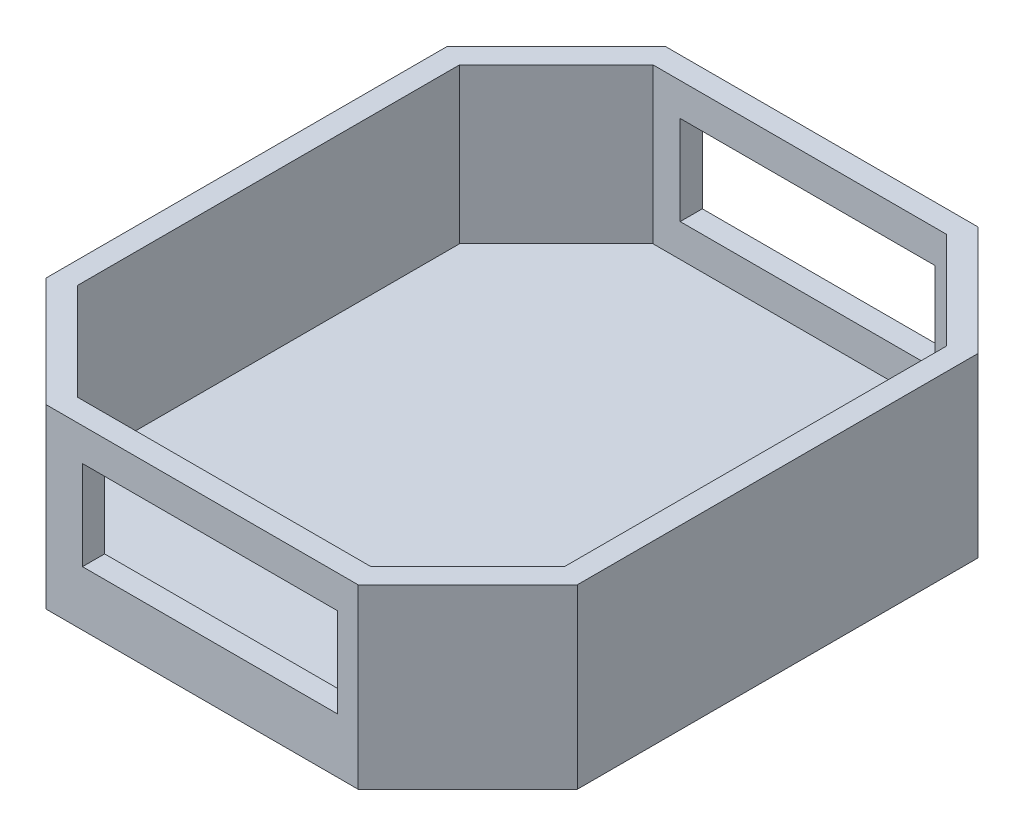
ISO-10303-21;
HEADER;
FILE_DESCRIPTION(('STEP AP214'),'2;1');
FILE_NAME('part.step','',(''),(''),'','','');
FILE_SCHEMA(('AUTOMOTIVE_DESIGN { 1 0 10303 214 1 1 1 1 }'));
ENDSEC;
DATA;
#1=APPLICATION_CONTEXT('core data for automotive mechanical design processes');
#2=APPLICATION_PROTOCOL_DEFINITION('international standard','automotive_design',2000,#1);
#3=PRODUCT_CONTEXT('',#1,'mechanical');
#4=PRODUCT('Part','Part','',(#3));
#5=PRODUCT_RELATED_PRODUCT_CATEGORY('part','',(#4));
#6=PRODUCT_DEFINITION_FORMATION('','',#4);
#7=PRODUCT_DEFINITION_CONTEXT('part definition',#1,'design');
#8=PRODUCT_DEFINITION('design','',#6,#7);
#9=PRODUCT_DEFINITION_SHAPE('','',#8);
#10=(LENGTH_UNIT() NAMED_UNIT(*) SI_UNIT(.MILLI.,.METRE.));
#11=(NAMED_UNIT(*) PLANE_ANGLE_UNIT() SI_UNIT($,.RADIAN.));
#12=(NAMED_UNIT(*) SI_UNIT($,.STERADIAN.) SOLID_ANGLE_UNIT());
#13=UNCERTAINTY_MEASURE_WITH_UNIT(LENGTH_MEASURE(1.E-05),#10,'distance_accuracy_value','');
#14=(GEOMETRIC_REPRESENTATION_CONTEXT(3) GLOBAL_UNCERTAINTY_ASSIGNED_CONTEXT((#13)) GLOBAL_UNIT_ASSIGNED_CONTEXT((#10,
#11,#12)) REPRESENTATION_CONTEXT('',''));
#15=CARTESIAN_POINT('',(0.,0.,0.));
#16=DIRECTION('',(0.,0.,1.));
#17=DIRECTION('',(1.,0.,0.));
#18=AXIS2_PLACEMENT_3D('',#15,#16,#17);
#19=CARTESIAN_POINT('',(0.,101.6,0.));
#20=DIRECTION('',(0.,1.,0.));
#21=DIRECTION('',(0.,0.,1.));
#22=AXIS2_PLACEMENT_3D('',#19,#20,#21);
#23=PLANE('',#22);
#24=DIRECTION('',(0.,0.,-1.));
#25=VECTOR('',#24,1.);
#26=CARTESIAN_POINT('',(-152.4,101.6,0.));
#27=LINE('',#26,#25);
#28=CARTESIAN_POINT('',(-152.4,101.6,114.938207152516));
#29=VERTEX_POINT('',#28);
#30=CARTESIAN_POINT('',(-152.4,101.6,-114.938207152516));
#31=VERTEX_POINT('',#30);
#32=EDGE_CURVE('E358',#29,#31,#27,.T.);
#33=ORIENTED_EDGE('',*,*,#32,.F.);
#34=DIRECTION('',(0.707106781186547,0.,0.707106781186548));
#35=VECTOR('',#34,1.);
#36=CARTESIAN_POINT('',(-133.669103576258,101.6,133.669103576258));
#37=LINE('',#36,#35);
#38=CARTESIAN_POINT('',(-89.538207152516,101.6,177.8));
#39=VERTEX_POINT('',#38);
#40=EDGE_CURVE('E362',#29,#39,#37,.T.);
#41=ORIENTED_EDGE('',*,*,#40,.T.);
#42=DIRECTION('',(1.,0.,0.));
#43=VECTOR('',#42,1.);
#44=CARTESIAN_POINT('',(0.,101.6,177.8));
#45=LINE('',#44,#43);
#46=CARTESIAN_POINT('',(89.538207152516,101.6,177.8));
#47=VERTEX_POINT('',#46);
#48=EDGE_CURVE('E366',#39,#47,#45,.T.);
#49=ORIENTED_EDGE('',*,*,#48,.T.);
#50=DIRECTION('',(-0.707106781186546,0.,0.707106781186549));
#51=VECTOR('',#50,1.);
#52=CARTESIAN_POINT('',(133.669103576258,101.6,133.669103576258));
#53=LINE('',#52,#51);
#54=CARTESIAN_POINT('',(152.4,101.6,114.938207152516));
#55=VERTEX_POINT('',#54);
#56=EDGE_CURVE('E369',#55,#47,#53,.T.);
#57=ORIENTED_EDGE('',*,*,#56,.F.);
#58=DIRECTION('',(0.,0.,-1.));
#59=VECTOR('',#58,1.);
#60=CARTESIAN_POINT('',(152.4,101.6,0.));
#61=LINE('',#60,#59);
#62=CARTESIAN_POINT('',(152.4,101.6,-114.938207152516));
#63=VERTEX_POINT('',#62);
#64=EDGE_CURVE('E373',#55,#63,#61,.T.);
#65=ORIENTED_EDGE('',*,*,#64,.T.);
#66=DIRECTION('',(-0.707106781186546,0.,-0.707106781186549));
#67=VECTOR('',#66,1.);
#68=CARTESIAN_POINT('',(133.669103576258,101.6,-133.669103576258));
#69=LINE('',#68,#67);
#70=CARTESIAN_POINT('',(89.538207152516,101.6,-177.8));
#71=VERTEX_POINT('',#70);
#72=EDGE_CURVE('E376',#63,#71,#69,.T.);
#73=ORIENTED_EDGE('',*,*,#72,.T.);
#74=DIRECTION('',(1.,0.,0.));
#75=VECTOR('',#74,1.);
#76=CARTESIAN_POINT('',(0.,101.6,-177.8));
#77=LINE('',#76,#75);
#78=CARTESIAN_POINT('',(-89.538207152516,101.6,-177.8));
#79=VERTEX_POINT('',#78);
#80=EDGE_CURVE('E379',#79,#71,#77,.T.);
#81=ORIENTED_EDGE('',*,*,#80,.F.);
#82=DIRECTION('',(0.707106781186546,0.,-0.707106781186549));
#83=VECTOR('',#82,1.);
#84=CARTESIAN_POINT('',(-133.669103576258,101.6,-133.669103576258));
#85=LINE('',#84,#83);
#86=EDGE_CURVE('E383',#31,#79,#85,.T.);
#87=ORIENTED_EDGE('',*,*,#86,.F.);
#88=EDGE_LOOP('',(#33,#41,#49,#57,#65,#73,#81,#87));
#89=FACE_BOUND('',#88,.T.);
#90=DIRECTION('',(0.707106781186547,0.,0.707106781186548));
#91=VECTOR('',#90,1.);
#92=CARTESIAN_POINT('',(-124.688847455189,101.6,124.688847455189));
#93=LINE('',#92,#91);
#94=CARTESIAN_POINT('',(-139.7,101.6,109.677694910378));
#95=VERTEX_POINT('',#94);
#96=CARTESIAN_POINT('',(-84.2776949103777,101.6,165.1));
#97=VERTEX_POINT('',#96);
#98=EDGE_CURVE('E335',#95,#97,#93,.T.);
#99=ORIENTED_EDGE('',*,*,#98,.F.);
#100=DIRECTION('',(0.,0.,-1.));
#101=VECTOR('',#100,1.);
#102=CARTESIAN_POINT('',(-139.7,101.6,0.));
#103=LINE('',#102,#101);
#104=CARTESIAN_POINT('',(-139.7,101.6,-109.677694910377));
#105=VERTEX_POINT('',#104);
#106=EDGE_CURVE('E331',#95,#105,#103,.T.);
#107=ORIENTED_EDGE('',*,*,#106,.T.);
#108=DIRECTION('',(0.707106781186546,0.,-0.707106781186549));
#109=VECTOR('',#108,1.);
#110=CARTESIAN_POINT('',(-124.688847455189,101.6,-124.688847455189));
#111=LINE('',#110,#109);
#112=CARTESIAN_POINT('',(-84.2776949103777,101.6,-165.1));
#113=VERTEX_POINT('',#112);
#114=EDGE_CURVE('E287',#105,#113,#111,.T.);
#115=ORIENTED_EDGE('',*,*,#114,.T.);
#116=DIRECTION('',(1.,0.,0.));
#117=VECTOR('',#116,1.);
#118=CARTESIAN_POINT('',(0.,101.6,-165.1));
#119=LINE('',#118,#117);
#120=CARTESIAN_POINT('',(84.2776949103777,101.6,-165.1));
#121=VERTEX_POINT('',#120);
#122=EDGE_CURVE('E351',#113,#121,#119,.T.);
#123=ORIENTED_EDGE('',*,*,#122,.T.);
#124=DIRECTION('',(-0.707106781186546,0.,-0.707106781186549));
#125=VECTOR('',#124,1.);
#126=CARTESIAN_POINT('',(124.688847455189,101.6,-124.688847455189));
#127=LINE('',#126,#125);
#128=CARTESIAN_POINT('',(139.7,101.6,-109.677694910377));
#129=VERTEX_POINT('',#128);
#130=EDGE_CURVE('E348',#129,#121,#127,.T.);
#131=ORIENTED_EDGE('',*,*,#130,.F.);
#132=DIRECTION('',(0.,0.,-1.));
#133=VECTOR('',#132,1.);
#134=CARTESIAN_POINT('',(139.7,101.6,0.));
#135=LINE('',#134,#133);
#136=CARTESIAN_POINT('',(139.7,101.6,109.677694910377));
#137=VERTEX_POINT('',#136);
#138=EDGE_CURVE('E345',#137,#129,#135,.T.);
#139=ORIENTED_EDGE('',*,*,#138,.F.);
#140=DIRECTION('',(-0.707106781186546,0.,0.707106781186549));
#141=VECTOR('',#140,1.);
#142=CARTESIAN_POINT('',(124.688847455189,101.6,124.688847455189));
#143=LINE('',#142,#141);
#144=CARTESIAN_POINT('',(84.2776949103777,101.6,165.1));
#145=VERTEX_POINT('',#144);
#146=EDGE_CURVE('E341',#137,#145,#143,.T.);
#147=ORIENTED_EDGE('',*,*,#146,.T.);
#148=DIRECTION('',(1.,0.,0.));
#149=VECTOR('',#148,1.);
#150=CARTESIAN_POINT('',(0.,101.6,165.1));
#151=LINE('',#150,#149);
#152=EDGE_CURVE('E338',#97,#145,#151,.T.);
#153=ORIENTED_EDGE('',*,*,#152,.F.);
#154=EDGE_LOOP('',(#99,#107,#115,#123,#131,#139,#147,#153));
#155=FACE_BOUND('',#154,.T.);
#156=ADVANCED_FACE('F40',(#89,#155),#23,.T.);
#157=CARTESIAN_POINT('',(-152.4,101.6,0.));
#158=DIRECTION('',(-1.,0.,0.));
#159=DIRECTION('',(0.,0.,1.));
#160=AXIS2_PLACEMENT_3D('',#157,#158,#159);
#161=PLANE('',#160);
#162=DIRECTION('',(0.,0.,-1.));
#163=VECTOR('',#162,1.);
#164=CARTESIAN_POINT('',(-152.4,0.,0.));
#165=LINE('',#164,#163);
#166=CARTESIAN_POINT('',(-152.4,0.,114.938207152516));
#167=VERTEX_POINT('',#166);
#168=CARTESIAN_POINT('',(-152.4,0.,-114.938207152516));
#169=VERTEX_POINT('',#168);
#170=EDGE_CURVE('E281',#167,#169,#165,.T.);
#171=ORIENTED_EDGE('',*,*,#170,.F.);
#172=DIRECTION('',(0.,-1.,0.));
#173=VECTOR('',#172,1.);
#174=CARTESIAN_POINT('',(-152.4,101.6,114.938207152516));
#175=LINE('',#174,#173);
#176=EDGE_CURVE('E438',#29,#167,#175,.T.);
#177=ORIENTED_EDGE('',*,*,#176,.F.);
#178=ORIENTED_EDGE('',*,*,#32,.T.);
#179=DIRECTION('',(0.,-1.,0.));
#180=VECTOR('',#179,1.);
#181=CARTESIAN_POINT('',(-152.4,101.6,-114.938207152516));
#182=LINE('',#181,#180);
#183=EDGE_CURVE('E387',#31,#169,#182,.T.);
#184=ORIENTED_EDGE('',*,*,#183,.T.);
#185=EDGE_LOOP('',(#171,#177,#178,#184));
#186=FACE_BOUND('',#185,.T.);
#187=ADVANCED_FACE('F42',(#186),#161,.T.);
#188=CARTESIAN_POINT('',(-133.669103576258,101.6,133.669103576258));
#189=DIRECTION('',(0.707106781186548,0.,-0.707106781186547));
#190=DIRECTION('',(-0.707106781186547,0.,-0.707106781186548));
#191=AXIS2_PLACEMENT_3D('',#188,#189,#190);
#192=PLANE('',#191);
#193=DIRECTION('',(0.707106781186547,0.,0.707106781186548));
#194=VECTOR('',#193,1.);
#195=CARTESIAN_POINT('',(-133.669103576258,0.,133.669103576258));
#196=LINE('',#195,#194);
#197=CARTESIAN_POINT('',(-89.538207152516,0.,177.8));
#198=VERTEX_POINT('',#197);
#199=EDGE_CURVE('E391',#167,#198,#196,.T.);
#200=ORIENTED_EDGE('',*,*,#199,.T.);
#201=DIRECTION('',(0.,-1.,0.));
#202=VECTOR('',#201,1.);
#203=CARTESIAN_POINT('',(-89.538207152516,101.6,177.8));
#204=LINE('',#203,#202);
#205=EDGE_CURVE('E434',#39,#198,#204,.T.);
#206=ORIENTED_EDGE('',*,*,#205,.F.);
#207=ORIENTED_EDGE('',*,*,#40,.F.);
#208=ORIENTED_EDGE('',*,*,#176,.T.);
#209=EDGE_LOOP('',(#200,#206,#207,#208));
#210=FACE_BOUND('',#209,.T.);
#211=ADVANCED_FACE('F475',(#210),#192,.F.);
#212=CARTESIAN_POINT('',(0.,101.6,177.8));
#213=DIRECTION('',(0.,0.,-1.));
#214=DIRECTION('',(-1.,0.,0.));
#215=AXIS2_PLACEMENT_3D('',#212,#213,#214);
#216=PLANE('',#215);
#217=DIRECTION('',(-1.,0.,0.));
#218=VECTOR('',#217,1.);
#219=CARTESIAN_POINT('',(0.,31.5269986114117,177.8));
#220=LINE('',#219,#218);
#221=CARTESIAN_POINT('',(77.5539961818055,31.5269986114117,177.8));
#222=VERTEX_POINT('',#221);
#223=CARTESIAN_POINT('',(-68.611413043314,31.5269986114117,177.8));
#224=VERTEX_POINT('',#223);
#225=EDGE_CURVE('E247',#222,#224,#220,.T.);
#226=ORIENTED_EDGE('',*,*,#225,.T.);
#227=DIRECTION('',(0.,1.,0.));
#228=VECTOR('',#227,1.);
#229=CARTESIAN_POINT('',(-68.611413043314,101.6,177.8));
#230=LINE('',#229,#228);
#231=CARTESIAN_POINT('',(-68.611413043314,82.7779494950676,177.8));
#232=VERTEX_POINT('',#231);
#233=EDGE_CURVE('E269',#224,#232,#230,.T.);
#234=ORIENTED_EDGE('',*,*,#233,.T.);
#235=DIRECTION('',(1.,0.,0.));
#236=VECTOR('',#235,1.);
#237=CARTESIAN_POINT('',(0.,82.7779494950676,177.8));
#238=LINE('',#237,#236);
#239=CARTESIAN_POINT('',(77.5539961818055,82.7779494950676,177.8));
#240=VERTEX_POINT('',#239);
#241=EDGE_CURVE('E262',#232,#240,#238,.T.);
#242=ORIENTED_EDGE('',*,*,#241,.T.);
#243=DIRECTION('',(0.,-1.,0.));
#244=VECTOR('',#243,1.);
#245=CARTESIAN_POINT('',(77.5539961818055,101.6,177.8));
#246=LINE('',#245,#244);
#247=EDGE_CURVE('E255',#240,#222,#246,.T.);
#248=ORIENTED_EDGE('',*,*,#247,.T.);
#249=EDGE_LOOP('',(#226,#234,#242,#248));
#250=FACE_BOUND('',#249,.T.);
#251=DIRECTION('',(1.,0.,0.));
#252=VECTOR('',#251,1.);
#253=CARTESIAN_POINT('',(0.,0.,177.8));
#254=LINE('',#253,#252);
#255=CARTESIAN_POINT('',(89.538207152516,0.,177.8));
#256=VERTEX_POINT('',#255);
#257=EDGE_CURVE('E394',#198,#256,#254,.T.);
#258=ORIENTED_EDGE('',*,*,#257,.T.);
#259=DIRECTION('',(0.,-1.,0.));
#260=VECTOR('',#259,1.);
#261=CARTESIAN_POINT('',(89.538207152516,101.6,177.8));
#262=LINE('',#261,#260);
#263=EDGE_CURVE('E431',#47,#256,#262,.T.);
#264=ORIENTED_EDGE('',*,*,#263,.F.);
#265=ORIENTED_EDGE('',*,*,#48,.F.);
#266=ORIENTED_EDGE('',*,*,#205,.T.);
#267=EDGE_LOOP('',(#258,#264,#265,#266));
#268=FACE_BOUND('',#267,.T.);
#269=ADVANCED_FACE('F504',(#250,#268),#216,.F.);
#270=CARTESIAN_POINT('',(133.669103576258,101.6,133.669103576258));
#271=DIRECTION('',(0.707106781186549,0.,0.707106781186546));
#272=DIRECTION('',(0.707106781186546,0.,-0.707106781186549));
#273=AXIS2_PLACEMENT_3D('',#270,#271,#272);
#274=PLANE('',#273);
#275=DIRECTION('',(-0.707106781186546,0.,0.707106781186549));
#276=VECTOR('',#275,1.);
#277=CARTESIAN_POINT('',(133.669103576258,0.,133.669103576258));
#278=LINE('',#277,#276);
#279=CARTESIAN_POINT('',(152.4,0.,114.938207152516));
#280=VERTEX_POINT('',#279);
#281=EDGE_CURVE('E398',#280,#256,#278,.T.);
#282=ORIENTED_EDGE('',*,*,#281,.F.);
#283=DIRECTION('',(0.,-1.,0.));
#284=VECTOR('',#283,1.);
#285=CARTESIAN_POINT('',(152.4,101.6,114.938207152516));
#286=LINE('',#285,#284);
#287=EDGE_CURVE('E428',#55,#280,#286,.T.);
#288=ORIENTED_EDGE('',*,*,#287,.F.);
#289=ORIENTED_EDGE('',*,*,#56,.T.);
#290=ORIENTED_EDGE('',*,*,#263,.T.);
#291=EDGE_LOOP('',(#282,#288,#289,#290));
#292=FACE_BOUND('',#291,.T.);
#293=ADVANCED_FACE('F500',(#292),#274,.T.);
#294=CARTESIAN_POINT('',(152.4,101.6,0.));
#295=DIRECTION('',(-1.,0.,0.));
#296=DIRECTION('',(0.,0.,1.));
#297=AXIS2_PLACEMENT_3D('',#294,#295,#296);
#298=PLANE('',#297);
#299=DIRECTION('',(0.,0.,-1.));
#300=VECTOR('',#299,1.);
#301=CARTESIAN_POINT('',(152.4,0.,0.));
#302=LINE('',#301,#300);
#303=CARTESIAN_POINT('',(152.4,0.,-114.938207152516));
#304=VERTEX_POINT('',#303);
#305=EDGE_CURVE('E402',#280,#304,#302,.T.);
#306=ORIENTED_EDGE('',*,*,#305,.T.);
#307=DIRECTION('',(0.,-1.,0.));
#308=VECTOR('',#307,1.);
#309=CARTESIAN_POINT('',(152.4,101.6,-114.938207152516));
#310=LINE('',#309,#308);
#311=EDGE_CURVE('E424',#63,#304,#310,.T.);
#312=ORIENTED_EDGE('',*,*,#311,.F.);
#313=ORIENTED_EDGE('',*,*,#64,.F.);
#314=ORIENTED_EDGE('',*,*,#287,.T.);
#315=EDGE_LOOP('',(#306,#312,#313,#314));
#316=FACE_BOUND('',#315,.T.);
#317=ADVANCED_FACE('F496',(#316),#298,.F.);
#318=CARTESIAN_POINT('',(133.669103576258,101.6,-133.669103576258));
#319=DIRECTION('',(-0.707106781186549,0.,0.707106781186546));
#320=DIRECTION('',(0.707106781186546,0.,0.707106781186549));
#321=AXIS2_PLACEMENT_3D('',#318,#319,#320);
#322=PLANE('',#321);
#323=DIRECTION('',(-0.707106781186546,0.,-0.707106781186549));
#324=VECTOR('',#323,1.);
#325=CARTESIAN_POINT('',(133.669103576258,0.,-133.669103576258));
#326=LINE('',#325,#324);
#327=CARTESIAN_POINT('',(89.538207152516,0.,-177.8));
#328=VERTEX_POINT('',#327);
#329=EDGE_CURVE('E405',#304,#328,#326,.T.);
#330=ORIENTED_EDGE('',*,*,#329,.T.);
#331=DIRECTION('',(0.,-1.,0.));
#332=VECTOR('',#331,1.);
#333=CARTESIAN_POINT('',(89.538207152516,101.6,-177.8));
#334=LINE('',#333,#332);
#335=EDGE_CURVE('E421',#71,#328,#334,.T.);
#336=ORIENTED_EDGE('',*,*,#335,.F.);
#337=ORIENTED_EDGE('',*,*,#72,.F.);
#338=ORIENTED_EDGE('',*,*,#311,.T.);
#339=EDGE_LOOP('',(#330,#336,#337,#338));
#340=FACE_BOUND('',#339,.T.);
#341=ADVANCED_FACE('F493',(#340),#322,.F.);
#342=CARTESIAN_POINT('',(0.,101.6,-177.8));
#343=DIRECTION('',(0.,0.,-1.));
#344=DIRECTION('',(-1.,0.,0.));
#345=AXIS2_PLACEMENT_3D('',#342,#343,#344);
#346=PLANE('',#345);
#347=DIRECTION('',(0.,-1.,0.));
#348=VECTOR('',#347,1.);
#349=CARTESIAN_POINT('',(-68.611413043314,31.5269986114117,-177.8));
#350=LINE('',#349,#348);
#351=CARTESIAN_POINT('',(-68.611413043314,82.7779494950676,-177.8));
#352=VERTEX_POINT('',#351);
#353=CARTESIAN_POINT('',(-68.611413043314,31.5269986114117,-177.8));
#354=VERTEX_POINT('',#353);
#355=EDGE_CURVE('E208',#352,#354,#350,.T.);
#356=ORIENTED_EDGE('',*,*,#355,.T.);
#357=DIRECTION('',(1.,0.,0.));
#358=VECTOR('',#357,1.);
#359=CARTESIAN_POINT('',(-68.611413043314,31.5269986114117,-177.8));
#360=LINE('',#359,#358);
#361=CARTESIAN_POINT('',(77.5539961818055,31.5269986114117,-177.8));
#362=VERTEX_POINT('',#361);
#363=EDGE_CURVE('E216',#354,#362,#360,.T.);
#364=ORIENTED_EDGE('',*,*,#363,.T.);
#365=DIRECTION('',(0.,1.,0.));
#366=VECTOR('',#365,1.);
#367=CARTESIAN_POINT('',(77.5539961818055,31.5269986114117,-177.8));
#368=LINE('',#367,#366);
#369=CARTESIAN_POINT('',(77.5539961818055,82.7779494950676,-177.8));
#370=VERTEX_POINT('',#369);
#371=EDGE_CURVE('E64',#362,#370,#368,.T.);
#372=ORIENTED_EDGE('',*,*,#371,.T.);
#373=DIRECTION('',(-1.,0.,0.));
#374=VECTOR('',#373,1.);
#375=CARTESIAN_POINT('',(-68.611413043314,82.7779494950676,-177.8));
#376=LINE('',#375,#374);
#377=EDGE_CURVE('E225',#370,#352,#376,.T.);
#378=ORIENTED_EDGE('',*,*,#377,.T.);
#379=EDGE_LOOP('',(#356,#364,#372,#378));
#380=FACE_BOUND('',#379,.T.);
#381=DIRECTION('',(1.,0.,0.));
#382=VECTOR('',#381,1.);
#383=CARTESIAN_POINT('',(0.,0.,-177.8));
#384=LINE('',#383,#382);
#385=CARTESIAN_POINT('',(-89.538207152516,0.,-177.8));
#386=VERTEX_POINT('',#385);
#387=EDGE_CURVE('E409',#386,#328,#384,.T.);
#388=ORIENTED_EDGE('',*,*,#387,.F.);
#389=DIRECTION('',(0.,-1.,0.));
#390=VECTOR('',#389,1.);
#391=CARTESIAN_POINT('',(-89.538207152516,101.6,-177.8));
#392=LINE('',#391,#390);
#393=EDGE_CURVE('E418',#79,#386,#392,.T.);
#394=ORIENTED_EDGE('',*,*,#393,.F.);
#395=ORIENTED_EDGE('',*,*,#80,.T.);
#396=ORIENTED_EDGE('',*,*,#335,.T.);
#397=EDGE_LOOP('',(#388,#394,#395,#396));
#398=FACE_BOUND('',#397,.T.);
#399=ADVANCED_FACE('F222',(#380,#398),#346,.T.);
#400=CARTESIAN_POINT('',(-133.669103576258,101.6,-133.669103576258));
#401=DIRECTION('',(-0.707106781186549,0.,-0.707106781186546));
#402=DIRECTION('',(-0.707106781186546,0.,0.707106781186549));
#403=AXIS2_PLACEMENT_3D('',#400,#401,#402);
#404=PLANE('',#403);
#405=DIRECTION('',(0.707106781186546,0.,-0.707106781186549));
#406=VECTOR('',#405,1.);
#407=CARTESIAN_POINT('',(-133.669103576258,0.,-133.669103576258));
#408=LINE('',#407,#406);
#409=EDGE_CURVE('E363',#169,#386,#408,.T.);
#410=ORIENTED_EDGE('',*,*,#409,.F.);
#411=ORIENTED_EDGE('',*,*,#183,.F.);
#412=ORIENTED_EDGE('',*,*,#86,.T.);
#413=ORIENTED_EDGE('',*,*,#393,.T.);
#414=EDGE_LOOP('',(#410,#411,#412,#413));
#415=FACE_BOUND('',#414,.T.);
#416=ADVANCED_FACE('F486',(#415),#404,.T.);
#417=CARTESIAN_POINT('',(0.,0.,0.));
#418=DIRECTION('',(0.,1.,0.));
#419=DIRECTION('',(0.,0.,1.));
#420=AXIS2_PLACEMENT_3D('',#417,#418,#419);
#421=PLANE('',#420);
#422=ORIENTED_EDGE('',*,*,#170,.T.);
#423=ORIENTED_EDGE('',*,*,#409,.T.);
#424=ORIENTED_EDGE('',*,*,#387,.T.);
#425=ORIENTED_EDGE('',*,*,#329,.F.);
#426=ORIENTED_EDGE('',*,*,#305,.F.);
#427=ORIENTED_EDGE('',*,*,#281,.T.);
#428=ORIENTED_EDGE('',*,*,#257,.F.);
#429=ORIENTED_EDGE('',*,*,#199,.F.);
#430=EDGE_LOOP('',(#422,#423,#424,#425,#426,#427,#428,#429));
#431=FACE_BOUND('',#430,.T.);
#432=ADVANCED_FACE('F482',(#431),#421,.F.);
#433=CARTESIAN_POINT('',(-139.7,101.6,0.));
#434=DIRECTION('',(-1.,0.,0.));
#435=DIRECTION('',(0.,0.,1.));
#436=AXIS2_PLACEMENT_3D('',#433,#434,#435);
#437=PLANE('',#436);
#438=DIRECTION('',(0.,0.,-1.));
#439=VECTOR('',#438,1.);
#440=CARTESIAN_POINT('',(-139.7,12.7,0.));
#441=LINE('',#440,#439);
#442=CARTESIAN_POINT('',(-139.7,12.7,109.677694910378));
#443=VERTEX_POINT('',#442);
#444=CARTESIAN_POINT('',(-139.7,12.7,-109.677694910377));
#445=VERTEX_POINT('',#444);
#446=EDGE_CURVE('E273',#443,#445,#441,.T.);
#447=ORIENTED_EDGE('',*,*,#446,.T.);
#448=DIRECTION('',(0.,-1.,0.));
#449=VECTOR('',#448,1.);
#450=CARTESIAN_POINT('',(-139.7,101.6,-109.677694910377));
#451=LINE('',#450,#449);
#452=EDGE_CURVE('E283',#105,#445,#451,.T.);
#453=ORIENTED_EDGE('',*,*,#452,.F.);
#454=ORIENTED_EDGE('',*,*,#106,.F.);
#455=DIRECTION('',(0.,-1.,0.));
#456=VECTOR('',#455,1.);
#457=CARTESIAN_POINT('',(-139.7,101.6,109.677694910378));
#458=LINE('',#457,#456);
#459=EDGE_CURVE('E278',#95,#443,#458,.T.);
#460=ORIENTED_EDGE('',*,*,#459,.T.);
#461=EDGE_LOOP('',(#447,#453,#454,#460));
#462=FACE_BOUND('',#461,.T.);
#463=ADVANCED_FACE('F485',(#462),#437,.F.);
#464=CARTESIAN_POINT('',(-124.688847455189,101.6,124.688847455189));
#465=DIRECTION('',(0.707106781186548,0.,-0.707106781186547));
#466=DIRECTION('',(-0.707106781186547,0.,-0.707106781186548));
#467=AXIS2_PLACEMENT_3D('',#464,#465,#466);
#468=PLANE('',#467);
#469=DIRECTION('',(0.707106781186547,0.,0.707106781186548));
#470=VECTOR('',#469,1.);
#471=CARTESIAN_POINT('',(-124.688847455189,12.7,124.688847455189));
#472=LINE('',#471,#470);
#473=CARTESIAN_POINT('',(-84.2776949103777,12.7,165.1));
#474=VERTEX_POINT('',#473);
#475=EDGE_CURVE('E277',#443,#474,#472,.T.);
#476=ORIENTED_EDGE('',*,*,#475,.F.);
#477=ORIENTED_EDGE('',*,*,#459,.F.);
#478=ORIENTED_EDGE('',*,*,#98,.T.);
#479=DIRECTION('',(0.,-1.,0.));
#480=VECTOR('',#479,1.);
#481=CARTESIAN_POINT('',(-84.2776949103777,101.6,165.1));
#482=LINE('',#481,#480);
#483=EDGE_CURVE('E282',#97,#474,#482,.T.);
#484=ORIENTED_EDGE('',*,*,#483,.T.);
#485=EDGE_LOOP('',(#476,#477,#478,#484));
#486=FACE_BOUND('',#485,.T.);
#487=ADVANCED_FACE('F574',(#486),#468,.T.);
#488=CARTESIAN_POINT('',(0.,101.6,165.1));
#489=DIRECTION('',(0.,0.,-1.));
#490=DIRECTION('',(-1.,0.,0.));
#491=AXIS2_PLACEMENT_3D('',#488,#489,#490);
#492=PLANE('',#491);
#493=DIRECTION('',(0.,1.,0.));
#494=VECTOR('',#493,1.);
#495=CARTESIAN_POINT('',(-68.611413043314,101.6,165.1));
#496=LINE('',#495,#494);
#497=CARTESIAN_POINT('',(-68.611413043314,31.5269986114117,165.1));
#498=VERTEX_POINT('',#497);
#499=CARTESIAN_POINT('',(-68.611413043314,82.7779494950676,165.1));
#500=VERTEX_POINT('',#499);
#501=EDGE_CURVE('E266',#498,#500,#496,.T.);
#502=ORIENTED_EDGE('',*,*,#501,.F.);
#503=DIRECTION('',(-1.,0.,0.));
#504=VECTOR('',#503,1.);
#505=CARTESIAN_POINT('',(0.,31.5269986114117,165.1));
#506=LINE('',#505,#504);
#507=CARTESIAN_POINT('',(77.5539961818055,31.5269986114117,165.1));
#508=VERTEX_POINT('',#507);
#509=EDGE_CURVE('E236',#508,#498,#506,.T.);
#510=ORIENTED_EDGE('',*,*,#509,.F.);
#511=DIRECTION('',(0.,-1.,0.));
#512=VECTOR('',#511,1.);
#513=CARTESIAN_POINT('',(77.5539961818055,101.6,165.1));
#514=LINE('',#513,#512);
#515=CARTESIAN_POINT('',(77.5539961818055,82.7779494950676,165.1));
#516=VERTEX_POINT('',#515);
#517=EDGE_CURVE('E251',#516,#508,#514,.T.);
#518=ORIENTED_EDGE('',*,*,#517,.F.);
#519=DIRECTION('',(1.,0.,0.));
#520=VECTOR('',#519,1.);
#521=CARTESIAN_POINT('',(0.,82.7779494950676,165.1));
#522=LINE('',#521,#520);
#523=EDGE_CURVE('E259',#500,#516,#522,.T.);
#524=ORIENTED_EDGE('',*,*,#523,.F.);
#525=EDGE_LOOP('',(#502,#510,#518,#524));
#526=FACE_BOUND('',#525,.T.);
#527=DIRECTION('',(1.,0.,0.));
#528=VECTOR('',#527,1.);
#529=CARTESIAN_POINT('',(0.,12.7,165.1));
#530=LINE('',#529,#528);
#531=CARTESIAN_POINT('',(84.2776949103777,12.7,165.1));
#532=VERTEX_POINT('',#531);
#533=EDGE_CURVE('E290',#474,#532,#530,.T.);
#534=ORIENTED_EDGE('',*,*,#533,.F.);
#535=ORIENTED_EDGE('',*,*,#483,.F.);
#536=ORIENTED_EDGE('',*,*,#152,.T.);
#537=DIRECTION('',(0.,-1.,0.));
#538=VECTOR('',#537,1.);
#539=CARTESIAN_POINT('',(84.2776949103777,101.6,165.1));
#540=LINE('',#539,#538);
#541=EDGE_CURVE('E294',#145,#532,#540,.T.);
#542=ORIENTED_EDGE('',*,*,#541,.T.);
#543=EDGE_LOOP('',(#534,#535,#536,#542));
#544=FACE_BOUND('',#543,.T.);
#545=ADVANCED_FACE('F582',(#526,#544),#492,.T.);
#546=CARTESIAN_POINT('',(124.688847455189,101.6,124.688847455189));
#547=DIRECTION('',(0.707106781186549,0.,0.707106781186546));
#548=DIRECTION('',(0.707106781186546,0.,-0.707106781186549));
#549=AXIS2_PLACEMENT_3D('',#546,#547,#548);
#550=PLANE('',#549);
#551=DIRECTION('',(-0.707106781186546,0.,0.707106781186549));
#552=VECTOR('',#551,1.);
#553=CARTESIAN_POINT('',(124.688847455189,12.7,124.688847455189));
#554=LINE('',#553,#552);
#555=CARTESIAN_POINT('',(139.7,12.7,109.677694910377));
#556=VERTEX_POINT('',#555);
#557=EDGE_CURVE('E298',#556,#532,#554,.T.);
#558=ORIENTED_EDGE('',*,*,#557,.T.);
#559=ORIENTED_EDGE('',*,*,#541,.F.);
#560=ORIENTED_EDGE('',*,*,#146,.F.);
#561=DIRECTION('',(0.,-1.,0.));
#562=VECTOR('',#561,1.);
#563=CARTESIAN_POINT('',(139.7,101.6,109.677694910377));
#564=LINE('',#563,#562);
#565=EDGE_CURVE('E301',#137,#556,#564,.T.);
#566=ORIENTED_EDGE('',*,*,#565,.T.);
#567=EDGE_LOOP('',(#558,#559,#560,#566));
#568=FACE_BOUND('',#567,.T.);
#569=ADVANCED_FACE('F591',(#568),#550,.F.);
#570=CARTESIAN_POINT('',(139.7,101.6,0.));
#571=DIRECTION('',(-1.,0.,0.));
#572=DIRECTION('',(0.,0.,1.));
#573=AXIS2_PLACEMENT_3D('',#570,#571,#572);
#574=PLANE('',#573);
#575=DIRECTION('',(0.,0.,-1.));
#576=VECTOR('',#575,1.);
#577=CARTESIAN_POINT('',(139.7,12.7,0.));
#578=LINE('',#577,#576);
#579=CARTESIAN_POINT('',(139.7,12.7,-109.677694910377));
#580=VERTEX_POINT('',#579);
#581=EDGE_CURVE('E305',#556,#580,#578,.T.);
#582=ORIENTED_EDGE('',*,*,#581,.F.);
#583=ORIENTED_EDGE('',*,*,#565,.F.);
#584=ORIENTED_EDGE('',*,*,#138,.T.);
#585=DIRECTION('',(0.,-1.,0.));
#586=VECTOR('',#585,1.);
#587=CARTESIAN_POINT('',(139.7,101.6,-109.677694910377));
#588=LINE('',#587,#586);
#589=EDGE_CURVE('E308',#129,#580,#588,.T.);
#590=ORIENTED_EDGE('',*,*,#589,.T.);
#591=EDGE_LOOP('',(#582,#583,#584,#590));
#592=FACE_BOUND('',#591,.T.);
#593=ADVANCED_FACE('F601',(#592),#574,.T.);
#594=CARTESIAN_POINT('',(124.688847455189,101.6,-124.688847455189));
#595=DIRECTION('',(-0.707106781186549,0.,0.707106781186546));
#596=DIRECTION('',(0.707106781186546,0.,0.707106781186549));
#597=AXIS2_PLACEMENT_3D('',#594,#595,#596);
#598=PLANE('',#597);
#599=DIRECTION('',(-0.707106781186546,0.,-0.707106781186549));
#600=VECTOR('',#599,1.);
#601=CARTESIAN_POINT('',(124.688847455189,12.7,-124.688847455189));
#602=LINE('',#601,#600);
#603=CARTESIAN_POINT('',(84.2776949103777,12.7,-165.1));
#604=VERTEX_POINT('',#603);
#605=EDGE_CURVE('E311',#580,#604,#602,.T.);
#606=ORIENTED_EDGE('',*,*,#605,.F.);
#607=ORIENTED_EDGE('',*,*,#589,.F.);
#608=ORIENTED_EDGE('',*,*,#130,.T.);
#609=DIRECTION('',(0.,-1.,0.));
#610=VECTOR('',#609,1.);
#611=CARTESIAN_POINT('',(84.2776949103777,101.6,-165.1));
#612=LINE('',#611,#610);
#613=EDGE_CURVE('E315',#121,#604,#612,.T.);
#614=ORIENTED_EDGE('',*,*,#613,.T.);
#615=EDGE_LOOP('',(#606,#607,#608,#614));
#616=FACE_BOUND('',#615,.T.);
#617=ADVANCED_FACE('F608',(#616),#598,.T.);
#618=CARTESIAN_POINT('',(0.,101.6,-165.1));
#619=DIRECTION('',(0.,0.,-1.));
#620=DIRECTION('',(-1.,0.,0.));
#621=AXIS2_PLACEMENT_3D('',#618,#619,#620);
#622=PLANE('',#621);
#623=DIRECTION('',(-1.,0.,0.));
#624=VECTOR('',#623,1.);
#625=CARTESIAN_POINT('',(0.,31.5269986114117,-165.1));
#626=LINE('',#625,#624);
#627=CARTESIAN_POINT('',(77.5539961818055,31.5269986114117,-165.1));
#628=VERTEX_POINT('',#627);
#629=CARTESIAN_POINT('',(-68.611413043314,31.5269986114117,-165.1));
#630=VERTEX_POINT('',#629);
#631=EDGE_CURVE('E441',#628,#630,#626,.T.);
#632=ORIENTED_EDGE('',*,*,#631,.T.);
#633=DIRECTION('',(0.,1.,0.));
#634=VECTOR('',#633,1.);
#635=CARTESIAN_POINT('',(-68.611413043314,101.6,-165.1));
#636=LINE('',#635,#634);
#637=CARTESIAN_POINT('',(-68.611413043314,82.7779494950676,-165.1));
#638=VERTEX_POINT('',#637);
#639=EDGE_CURVE('E11',#630,#638,#636,.T.);
#640=ORIENTED_EDGE('',*,*,#639,.T.);
#641=DIRECTION('',(1.,0.,0.));
#642=VECTOR('',#641,1.);
#643=CARTESIAN_POINT('',(0.,82.7779494950676,-165.1));
#644=LINE('',#643,#642);
#645=CARTESIAN_POINT('',(77.5539961818055,82.7779494950676,-165.1));
#646=VERTEX_POINT('',#645);
#647=EDGE_CURVE('E49',#638,#646,#644,.T.);
#648=ORIENTED_EDGE('',*,*,#647,.T.);
#649=DIRECTION('',(0.,-1.,0.));
#650=VECTOR('',#649,1.);
#651=CARTESIAN_POINT('',(77.5539961818055,101.6,-165.1));
#652=LINE('',#651,#650);
#653=EDGE_CURVE('E444',#646,#628,#652,.T.);
#654=ORIENTED_EDGE('',*,*,#653,.T.);
#655=EDGE_LOOP('',(#632,#640,#648,#654));
#656=FACE_BOUND('',#655,.T.);
#657=DIRECTION('',(1.,0.,0.));
#658=VECTOR('',#657,1.);
#659=CARTESIAN_POINT('',(0.,12.7,-165.1));
#660=LINE('',#659,#658);
#661=CARTESIAN_POINT('',(-84.2776949103777,12.7,-165.1));
#662=VERTEX_POINT('',#661);
#663=EDGE_CURVE('E319',#662,#604,#660,.T.);
#664=ORIENTED_EDGE('',*,*,#663,.T.);
#665=ORIENTED_EDGE('',*,*,#613,.F.);
#666=ORIENTED_EDGE('',*,*,#122,.F.);
#667=DIRECTION('',(0.,-1.,0.));
#668=VECTOR('',#667,1.);
#669=CARTESIAN_POINT('',(-84.2776949103777,101.6,-165.1));
#670=LINE('',#669,#668);
#671=EDGE_CURVE('E286',#113,#662,#670,.T.);
#672=ORIENTED_EDGE('',*,*,#671,.T.);
#673=EDGE_LOOP('',(#664,#665,#666,#672));
#674=FACE_BOUND('',#673,.T.);
#675=ADVANCED_FACE('F450',(#656,#674),#622,.F.);
#676=CARTESIAN_POINT('',(-124.688847455189,101.6,-124.688847455189));
#677=DIRECTION('',(-0.707106781186549,0.,-0.707106781186546));
#678=DIRECTION('',(-0.707106781186546,0.,0.707106781186549));
#679=AXIS2_PLACEMENT_3D('',#676,#677,#678);
#680=PLANE('',#679);
#681=DIRECTION('',(0.707106781186546,0.,-0.707106781186549));
#682=VECTOR('',#681,1.);
#683=CARTESIAN_POINT('',(-124.688847455189,12.7,-124.688847455189));
#684=LINE('',#683,#682);
#685=EDGE_CURVE('E325',#445,#662,#684,.T.);
#686=ORIENTED_EDGE('',*,*,#685,.T.);
#687=ORIENTED_EDGE('',*,*,#671,.F.);
#688=ORIENTED_EDGE('',*,*,#114,.F.);
#689=ORIENTED_EDGE('',*,*,#452,.T.);
#690=EDGE_LOOP('',(#686,#687,#688,#689));
#691=FACE_BOUND('',#690,.T.);
#692=ADVANCED_FACE('F624',(#691),#680,.F.);
#693=CARTESIAN_POINT('',(0.,12.7,0.));
#694=DIRECTION('',(0.,1.,0.));
#695=DIRECTION('',(0.,0.,1.));
#696=AXIS2_PLACEMENT_3D('',#693,#694,#695);
#697=PLANE('',#696);
#698=ORIENTED_EDGE('',*,*,#446,.F.);
#699=ORIENTED_EDGE('',*,*,#475,.T.);
#700=ORIENTED_EDGE('',*,*,#533,.T.);
#701=ORIENTED_EDGE('',*,*,#557,.F.);
#702=ORIENTED_EDGE('',*,*,#581,.T.);
#703=ORIENTED_EDGE('',*,*,#605,.T.);
#704=ORIENTED_EDGE('',*,*,#663,.F.);
#705=ORIENTED_EDGE('',*,*,#685,.F.);
#706=EDGE_LOOP('',(#698,#699,#700,#701,#702,#703,#704,#705));
#707=FACE_BOUND('',#706,.T.);
#708=ADVANCED_FACE('F464',(#707),#697,.T.);
#709=CARTESIAN_POINT('',(-68.611413043314,31.5269986114117,-177.8));
#710=DIRECTION('',(0.,-1.,0.));
#711=DIRECTION('',(0.,0.,-1.));
#712=AXIS2_PLACEMENT_3D('',#709,#710,#711);
#713=PLANE('',#712);
#714=DIRECTION('',(0.,0.,1.));
#715=VECTOR('',#714,1.);
#716=CARTESIAN_POINT('',(77.5539961818055,31.5269986114117,-177.8));
#717=LINE('',#716,#715);
#718=EDGE_CURVE('E218',#362,#628,#717,.T.);
#719=ORIENTED_EDGE('',*,*,#718,.F.);
#720=ORIENTED_EDGE('',*,*,#363,.F.);
#721=DIRECTION('',(0.,0.,1.));
#722=VECTOR('',#721,1.);
#723=CARTESIAN_POINT('',(-68.611413043314,31.5269986114117,-177.8));
#724=LINE('',#723,#722);
#725=EDGE_CURVE('E203',#354,#630,#724,.T.);
#726=ORIENTED_EDGE('',*,*,#725,.T.);
#727=ORIENTED_EDGE('',*,*,#631,.F.);
#728=EDGE_LOOP('',(#719,#720,#726,#727));
#729=FACE_BOUND('',#728,.T.);
#730=ADVANCED_FACE('F217',(#729),#713,.F.);
#731=CARTESIAN_POINT('',(77.5539961818055,31.5269986114117,-177.8));
#732=DIRECTION('',(1.,0.,0.));
#733=DIRECTION('',(0.,0.,-1.));
#734=AXIS2_PLACEMENT_3D('',#731,#732,#733);
#735=PLANE('',#734);
#736=DIRECTION('',(0.,0.,1.));
#737=VECTOR('',#736,1.);
#738=CARTESIAN_POINT('',(77.5539961818055,82.7779494950676,-177.8));
#739=LINE('',#738,#737);
#740=EDGE_CURVE('E238',#370,#646,#739,.T.);
#741=ORIENTED_EDGE('',*,*,#740,.F.);
#742=ORIENTED_EDGE('',*,*,#371,.F.);
#743=ORIENTED_EDGE('',*,*,#718,.T.);
#744=ORIENTED_EDGE('',*,*,#653,.F.);
#745=EDGE_LOOP('',(#741,#742,#743,#744));
#746=FACE_BOUND('',#745,.T.);
#747=ADVANCED_FACE('F454',(#746),#735,.F.);
#748=CARTESIAN_POINT('',(-68.611413043314,82.7779494950676,-177.8));
#749=DIRECTION('',(0.,1.,0.));
#750=DIRECTION('',(0.,0.,1.));
#751=AXIS2_PLACEMENT_3D('',#748,#749,#750);
#752=PLANE('',#751);
#753=DIRECTION('',(0.,0.,1.));
#754=VECTOR('',#753,1.);
#755=CARTESIAN_POINT('',(-68.611413043314,82.7779494950676,-177.8));
#756=LINE('',#755,#754);
#757=EDGE_CURVE('E233',#352,#638,#756,.T.);
#758=ORIENTED_EDGE('',*,*,#757,.F.);
#759=ORIENTED_EDGE('',*,*,#377,.F.);
#760=ORIENTED_EDGE('',*,*,#740,.T.);
#761=ORIENTED_EDGE('',*,*,#647,.F.);
#762=EDGE_LOOP('',(#758,#759,#760,#761));
#763=FACE_BOUND('',#762,.T.);
#764=ADVANCED_FACE('F453',(#763),#752,.F.);
#765=CARTESIAN_POINT('',(-68.611413043314,31.5269986114117,-177.8));
#766=DIRECTION('',(-1.,0.,0.));
#767=DIRECTION('',(0.,0.,1.));
#768=AXIS2_PLACEMENT_3D('',#765,#766,#767);
#769=PLANE('',#768);
#770=ORIENTED_EDGE('',*,*,#725,.F.);
#771=ORIENTED_EDGE('',*,*,#355,.F.);
#772=ORIENTED_EDGE('',*,*,#757,.T.);
#773=ORIENTED_EDGE('',*,*,#639,.F.);
#774=EDGE_LOOP('',(#770,#771,#772,#773));
#775=FACE_BOUND('',#774,.T.);
#776=ADVANCED_FACE('F205',(#775),#769,.F.);
#777=EDGE_CURVE('E56',#498,#224,#724,.T.);
#778=ORIENTED_EDGE('',*,*,#777,.F.);
#779=ORIENTED_EDGE('',*,*,#501,.T.);
#780=EDGE_CURVE('E237',#500,#232,#756,.T.);
#781=ORIENTED_EDGE('',*,*,#780,.T.);
#782=ORIENTED_EDGE('',*,*,#233,.F.);
#783=EDGE_LOOP('',(#778,#779,#781,#782));
#784=FACE_BOUND('',#783,.T.);
#785=ADVANCED_FACE('F659',(#784),#769,.F.);
#786=ORIENTED_EDGE('',*,*,#780,.F.);
#787=ORIENTED_EDGE('',*,*,#523,.T.);
#788=EDGE_CURVE('E242',#516,#240,#739,.T.);
#789=ORIENTED_EDGE('',*,*,#788,.T.);
#790=ORIENTED_EDGE('',*,*,#241,.F.);
#791=EDGE_LOOP('',(#786,#787,#789,#790));
#792=FACE_BOUND('',#791,.T.);
#793=ADVANCED_FACE('F463',(#792),#752,.F.);
#794=ORIENTED_EDGE('',*,*,#788,.F.);
#795=ORIENTED_EDGE('',*,*,#517,.T.);
#796=EDGE_CURVE('E213',#508,#222,#717,.T.);
#797=ORIENTED_EDGE('',*,*,#796,.T.);
#798=ORIENTED_EDGE('',*,*,#247,.F.);
#799=EDGE_LOOP('',(#794,#795,#797,#798));
#800=FACE_BOUND('',#799,.T.);
#801=ADVANCED_FACE('F457',(#800),#735,.F.);
#802=ORIENTED_EDGE('',*,*,#796,.F.);
#803=ORIENTED_EDGE('',*,*,#509,.T.);
#804=ORIENTED_EDGE('',*,*,#777,.T.);
#805=ORIENTED_EDGE('',*,*,#225,.F.);
#806=EDGE_LOOP('',(#802,#803,#804,#805));
#807=FACE_BOUND('',#806,.T.);
#808=ADVANCED_FACE('F466',(#807),#713,.F.);
#809=CLOSED_SHELL('',(#156,#187,#211,#269,#293,#317,#341,#399,#416,#432,#463,#487,#545,#569,
#593,#617,#675,#692,#708,#730,#747,#764,#776,#785,#793,#801,#808));
#810=MANIFOLD_SOLID_BREP('B2',#809);
#811=ADVANCED_BREP_SHAPE_REPRESENTATION('',(#18,#810),#14);
#812=SHAPE_DEFINITION_REPRESENTATION(#9,#811);
ENDSEC;
END-ISO-10303-21;
